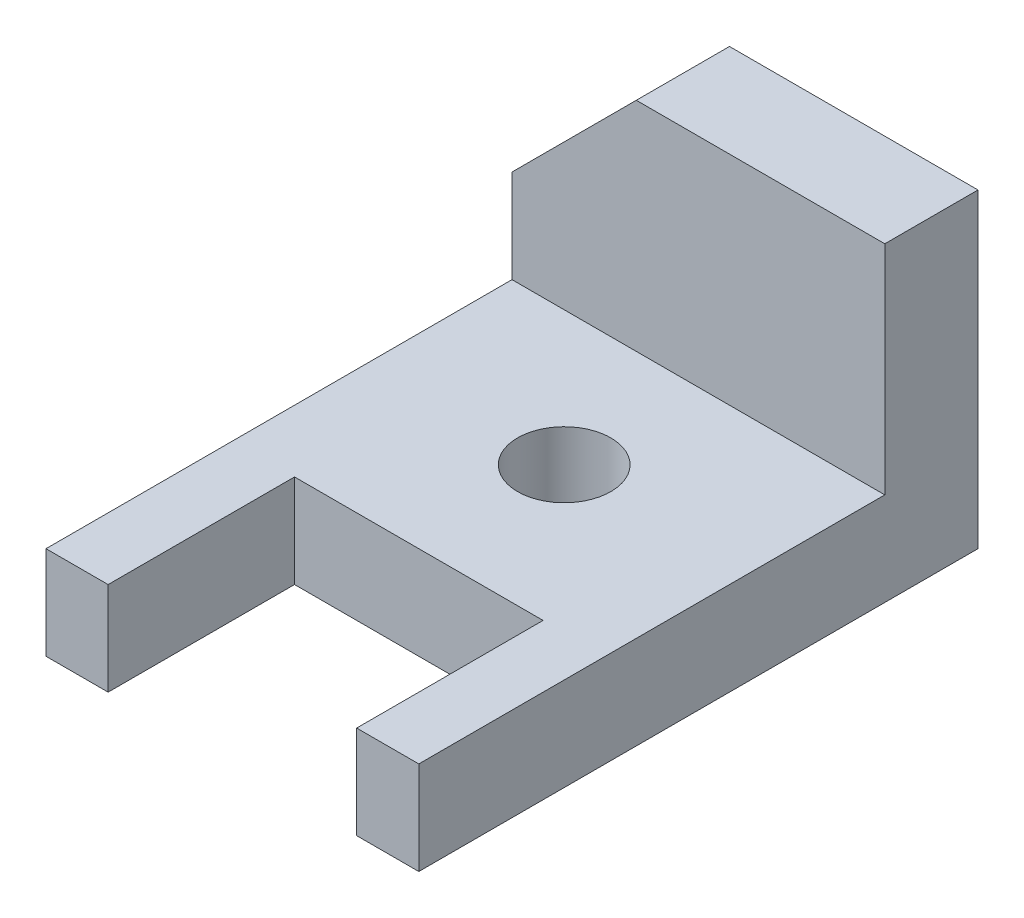
ISO-10303-21;
HEADER;
FILE_DESCRIPTION(('STEP AP214'),'2;1');
FILE_NAME('part.step','',(''),(''),'','','');
FILE_SCHEMA(('AUTOMOTIVE_DESIGN { 1 0 10303 214 1 1 1 1 }'));
ENDSEC;
DATA;
#1=APPLICATION_CONTEXT('core data for automotive mechanical design processes');
#2=APPLICATION_PROTOCOL_DEFINITION('international standard','automotive_design',2000,#1);
#3=PRODUCT_CONTEXT('',#1,'mechanical');
#4=PRODUCT('Part','Part','',(#3));
#5=PRODUCT_RELATED_PRODUCT_CATEGORY('part','',(#4));
#6=PRODUCT_DEFINITION_FORMATION('','',#4);
#7=PRODUCT_DEFINITION_CONTEXT('part definition',#1,'design');
#8=PRODUCT_DEFINITION('design','',#6,#7);
#9=PRODUCT_DEFINITION_SHAPE('','',#8);
#10=(LENGTH_UNIT() NAMED_UNIT(*) SI_UNIT(.MILLI.,.METRE.));
#11=(NAMED_UNIT(*) PLANE_ANGLE_UNIT() SI_UNIT($,.RADIAN.));
#12=(NAMED_UNIT(*) SI_UNIT($,.STERADIAN.) SOLID_ANGLE_UNIT());
#13=UNCERTAINTY_MEASURE_WITH_UNIT(LENGTH_MEASURE(1.E-05),#10,'distance_accuracy_value','');
#14=(GEOMETRIC_REPRESENTATION_CONTEXT(3) GLOBAL_UNCERTAINTY_ASSIGNED_CONTEXT((#13)) GLOBAL_UNIT_ASSIGNED_CONTEXT((#10,
#11,#12)) REPRESENTATION_CONTEXT('',''));
#15=CARTESIAN_POINT('',(0.,0.,0.));
#16=DIRECTION('',(0.,0.,1.));
#17=DIRECTION('',(1.,0.,0.));
#18=AXIS2_PLACEMENT_3D('',#15,#16,#17);
#19=CARTESIAN_POINT('',(-97.2844660194175,19.05,21.0844660194175));
#20=DIRECTION('',(0.,0.,-1.));
#21=DIRECTION('',(-1.,0.,0.));
#22=AXIS2_PLACEMENT_3D('',#19,#20,#21);
#23=PLANE('',#22);
#24=DIRECTION('',(1.,0.,0.));
#25=VECTOR('',#24,1.);
#26=CARTESIAN_POINT('',(-97.2844660194175,0.,21.0844660194175));
#27=LINE('',#26,#25);
#28=CARTESIAN_POINT('',(-173.484466019418,0.,21.0844660194175));
#29=VERTEX_POINT('',#28);
#30=CARTESIAN_POINT('',(-160.784466019418,0.,21.0844660194175));
#31=VERTEX_POINT('',#30);
#32=EDGE_CURVE('E150',#29,#31,#27,.T.);
#33=ORIENTED_EDGE('',*,*,#32,.T.);
#34=DIRECTION('',(0.,-1.,0.));
#35=VECTOR('',#34,1.);
#36=CARTESIAN_POINT('',(-160.784466019418,19.05,21.0844660194175));
#37=LINE('',#36,#35);
#38=CARTESIAN_POINT('',(-160.784466019418,19.05,21.0844660194175));
#39=VERTEX_POINT('',#38);
#40=EDGE_CURVE('E207',#39,#31,#37,.T.);
#41=ORIENTED_EDGE('',*,*,#40,.F.);
#42=DIRECTION('',(1.,0.,0.));
#43=VECTOR('',#42,1.);
#44=CARTESIAN_POINT('',(-97.2844660194175,19.05,21.0844660194175));
#45=LINE('',#44,#43);
#46=CARTESIAN_POINT('',(-173.484466019418,19.05,21.0844660194175));
#47=VERTEX_POINT('',#46);
#48=EDGE_CURVE('E153',#47,#39,#45,.T.);
#49=ORIENTED_EDGE('',*,*,#48,.F.);
#50=DIRECTION('',(0.,-1.,0.));
#51=VECTOR('',#50,1.);
#52=CARTESIAN_POINT('',(-173.484466019418,19.05,21.0844660194175));
#53=LINE('',#52,#51);
#54=EDGE_CURVE('E168',#47,#29,#53,.T.);
#55=ORIENTED_EDGE('',*,*,#54,.T.);
#56=EDGE_LOOP('',(#33,#41,#49,#55));
#57=FACE_BOUND('',#56,.T.);
#58=ADVANCED_FACE('F35',(#57),#23,.F.);
#59=CARTESIAN_POINT('',(-97.2844660194175,19.05,21.0844660194175));
#60=DIRECTION('',(-1.,0.,0.));
#61=DIRECTION('',(0.,0.,1.));
#62=AXIS2_PLACEMENT_3D('',#59,#60,#61);
#63=PLANE('',#62);
#64=DIRECTION('',(0.,0.,-1.));
#65=VECTOR('',#64,1.);
#66=CARTESIAN_POINT('',(-97.2844660194175,0.,21.0844660194175));
#67=LINE('',#66,#65);
#68=CARTESIAN_POINT('',(-97.2844660194175,0.,21.0844660194175));
#69=VERTEX_POINT('',#68);
#70=CARTESIAN_POINT('',(-97.2844660194175,0.,-93.2155339805825));
#71=VERTEX_POINT('',#70);
#72=EDGE_CURVE('E140',#69,#71,#67,.T.);
#73=ORIENTED_EDGE('',*,*,#72,.T.);
#74=DIRECTION('',(0.,-1.,0.));
#75=VECTOR('',#74,1.);
#76=CARTESIAN_POINT('',(-97.2844660194175,19.05,-93.2155339805825));
#77=LINE('',#76,#75);
#78=CARTESIAN_POINT('',(-97.2844660194175,63.5,-93.2155339805825));
#79=VERTEX_POINT('',#78);
#80=EDGE_CURVE('E43',#79,#71,#77,.T.);
#81=ORIENTED_EDGE('',*,*,#80,.F.);
#82=DIRECTION('',(0.,0.,1.));
#83=VECTOR('',#82,1.);
#84=CARTESIAN_POINT('',(-97.2844660194175,63.5,-93.2155339805825));
#85=LINE('',#84,#83);
#86=CARTESIAN_POINT('',(-97.2844660194175,63.5,-74.1655339805825));
#87=VERTEX_POINT('',#86);
#88=EDGE_CURVE('E182',#79,#87,#85,.T.);
#89=ORIENTED_EDGE('',*,*,#88,.T.);
#90=DIRECTION('',(0.,-1.,0.));
#91=VECTOR('',#90,1.);
#92=CARTESIAN_POINT('',(-97.2844660194175,63.5,-74.1655339805825));
#93=LINE('',#92,#91);
#94=CARTESIAN_POINT('',(-97.2844660194175,19.05,-74.1655339805825));
#95=VERTEX_POINT('',#94);
#96=EDGE_CURVE('E138',#87,#95,#93,.T.);
#97=ORIENTED_EDGE('',*,*,#96,.T.);
#98=DIRECTION('',(0.,0.,-1.));
#99=VECTOR('',#98,1.);
#100=CARTESIAN_POINT('',(-97.2844660194175,19.05,21.0844660194175));
#101=LINE('',#100,#99);
#102=CARTESIAN_POINT('',(-97.2844660194175,19.05,21.0844660194175));
#103=VERTEX_POINT('',#102);
#104=EDGE_CURVE('E148',#103,#95,#101,.T.);
#105=ORIENTED_EDGE('',*,*,#104,.F.);
#106=DIRECTION('',(0.,-1.,0.));
#107=VECTOR('',#106,1.);
#108=CARTESIAN_POINT('',(-97.2844660194175,19.05,21.0844660194175));
#109=LINE('',#108,#107);
#110=EDGE_CURVE('E156',#103,#69,#109,.T.);
#111=ORIENTED_EDGE('',*,*,#110,.T.);
#112=EDGE_LOOP('',(#73,#81,#89,#97,#105,#111));
#113=FACE_BOUND('',#112,.T.);
#114=ADVANCED_FACE('F37',(#113),#63,.F.);
#115=CARTESIAN_POINT('',(-97.2844660194175,19.05,-93.2155339805825));
#116=DIRECTION('',(0.,0.,1.));
#117=DIRECTION('',(1.,0.,0.));
#118=AXIS2_PLACEMENT_3D('',#115,#116,#117);
#119=PLANE('',#118);
#120=DIRECTION('',(0.,-1.,0.));
#121=VECTOR('',#120,1.);
#122=CARTESIAN_POINT('',(-173.484466019418,19.05,-93.2155339805825));
#123=LINE('',#122,#121);
#124=CARTESIAN_POINT('',(-173.484466019418,38.1,-93.2155339805825));
#125=VERTEX_POINT('',#124);
#126=CARTESIAN_POINT('',(-173.484466019418,0.,-93.2155339805825));
#127=VERTEX_POINT('',#126);
#128=EDGE_CURVE('E171',#125,#127,#123,.T.);
#129=ORIENTED_EDGE('',*,*,#128,.F.);
#130=DIRECTION('',(0.707106781186547,0.707106781186548,0.));
#131=VECTOR('',#130,1.);
#132=CARTESIAN_POINT('',(-144.909466019418,66.675,-93.2155339805825));
#133=LINE('',#132,#131);
#134=CARTESIAN_POINT('',(-148.084466019418,63.5,-93.2155339805825));
#135=VERTEX_POINT('',#134);
#136=EDGE_CURVE('E119',#125,#135,#133,.T.);
#137=ORIENTED_EDGE('',*,*,#136,.T.);
#138=DIRECTION('',(1.,0.,0.));
#139=VECTOR('',#138,1.);
#140=CARTESIAN_POINT('',(-97.2844660194175,63.5,-93.2155339805825));
#141=LINE('',#140,#139);
#142=EDGE_CURVE('E143',#135,#79,#141,.T.);
#143=ORIENTED_EDGE('',*,*,#142,.T.);
#144=ORIENTED_EDGE('',*,*,#80,.T.);
#145=DIRECTION('',(-1.,0.,0.));
#146=VECTOR('',#145,1.);
#147=CARTESIAN_POINT('',(-97.2844660194175,0.,-93.2155339805825));
#148=LINE('',#147,#146);
#149=EDGE_CURVE('E158',#71,#127,#148,.T.);
#150=ORIENTED_EDGE('',*,*,#149,.T.);
#151=EDGE_LOOP('',(#129,#137,#143,#144,#150));
#152=FACE_BOUND('',#151,.T.);
#153=ADVANCED_FACE('F175',(#152),#119,.F.);
#154=CARTESIAN_POINT('',(-173.484466019418,19.05,21.0844660194175));
#155=DIRECTION('',(1.,0.,0.));
#156=DIRECTION('',(0.,0.,-1.));
#157=AXIS2_PLACEMENT_3D('',#154,#155,#156);
#158=PLANE('',#157);
#159=DIRECTION('',(0.,-1.,0.));
#160=VECTOR('',#159,1.);
#161=CARTESIAN_POINT('',(-173.484466019418,63.5,-74.1655339805826));
#162=LINE('',#161,#160);
#163=CARTESIAN_POINT('',(-173.484466019418,38.1,-74.1655339805825));
#164=VERTEX_POINT('',#163);
#165=CARTESIAN_POINT('',(-173.484466019418,19.05,-74.1655339805825));
#166=VERTEX_POINT('',#165);
#167=EDGE_CURVE('E128',#164,#166,#162,.T.);
#168=ORIENTED_EDGE('',*,*,#167,.F.);
#169=DIRECTION('',(0.,0.,1.));
#170=VECTOR('',#169,1.);
#171=CARTESIAN_POINT('',(-173.484466019418,38.1,-112.265533980583));
#172=LINE('',#171,#170);
#173=EDGE_CURVE('E116',#125,#164,#172,.T.);
#174=ORIENTED_EDGE('',*,*,#173,.F.);
#175=ORIENTED_EDGE('',*,*,#128,.T.);
#176=DIRECTION('',(0.,0.,1.));
#177=VECTOR('',#176,1.);
#178=CARTESIAN_POINT('',(-173.484466019418,0.,21.0844660194175));
#179=LINE('',#178,#177);
#180=EDGE_CURVE('E161',#127,#29,#179,.T.);
#181=ORIENTED_EDGE('',*,*,#180,.T.);
#182=ORIENTED_EDGE('',*,*,#54,.F.);
#183=DIRECTION('',(0.,0.,1.));
#184=VECTOR('',#183,1.);
#185=CARTESIAN_POINT('',(-173.484466019418,19.05,21.0844660194175));
#186=LINE('',#185,#184);
#187=EDGE_CURVE('E136',#166,#47,#186,.T.);
#188=ORIENTED_EDGE('',*,*,#187,.F.);
#189=EDGE_LOOP('',(#168,#174,#175,#181,#182,#188));
#190=FACE_BOUND('',#189,.T.);
#191=ADVANCED_FACE('F134',(#190),#158,.F.);
#192=CARTESIAN_POINT('',(-109.984466019418,19.05,21.0844660194175));
#193=VERTEX_POINT('',#192);
#194=EDGE_CURVE('E152',#193,#103,#45,.T.);
#195=ORIENTED_EDGE('',*,*,#194,.F.);
#196=DIRECTION('',(0.,1.,0.));
#197=VECTOR('',#196,1.);
#198=CARTESIAN_POINT('',(-109.984466019418,19.05,21.0844660194175));
#199=LINE('',#198,#197);
#200=CARTESIAN_POINT('',(-109.984466019418,0.,21.0844660194175));
#201=VERTEX_POINT('',#200);
#202=EDGE_CURVE('E205',#201,#193,#199,.T.);
#203=ORIENTED_EDGE('',*,*,#202,.F.);
#204=EDGE_CURVE('E163',#201,#69,#27,.T.);
#205=ORIENTED_EDGE('',*,*,#204,.T.);
#206=ORIENTED_EDGE('',*,*,#110,.F.);
#207=EDGE_LOOP('',(#195,#203,#205,#206));
#208=FACE_BOUND('',#207,.T.);
#209=ADVANCED_FACE('F238',(#208),#23,.F.);
#210=CARTESIAN_POINT('',(0.,19.05,0.));
#211=DIRECTION('',(0.,1.,0.));
#212=DIRECTION('',(0.,0.,1.));
#213=AXIS2_PLACEMENT_3D('',#210,#211,#212);
#214=PLANE('',#213);
#215=DIRECTION('',(0.,0.,1.));
#216=VECTOR('',#215,1.);
#217=CARTESIAN_POINT('',(-160.784466019418,19.05,-17.0155339805825));
#218=LINE('',#217,#216);
#219=CARTESIAN_POINT('',(-160.784466019418,19.05,-17.0155339805825));
#220=VERTEX_POINT('',#219);
#221=EDGE_CURVE('E194',#220,#39,#218,.T.);
#222=ORIENTED_EDGE('',*,*,#221,.F.);
#223=DIRECTION('',(-1.,0.,0.));
#224=VECTOR('',#223,1.);
#225=CARTESIAN_POINT('',(-160.784466019418,19.05,-17.0155339805825));
#226=LINE('',#225,#224);
#227=CARTESIAN_POINT('',(-109.984466019418,19.05,-17.0155339805825));
#228=VERTEX_POINT('',#227);
#229=EDGE_CURVE('E199',#228,#220,#226,.T.);
#230=ORIENTED_EDGE('',*,*,#229,.F.);
#231=DIRECTION('',(0.,0.,1.));
#232=VECTOR('',#231,1.);
#233=CARTESIAN_POINT('',(-109.984466019418,19.05,-17.0155339805825));
#234=LINE('',#233,#232);
#235=EDGE_CURVE('E201',#228,#193,#234,.T.);
#236=ORIENTED_EDGE('',*,*,#235,.T.);
#237=ORIENTED_EDGE('',*,*,#194,.T.);
#238=ORIENTED_EDGE('',*,*,#104,.T.);
#239=DIRECTION('',(1.,0.,0.));
#240=VECTOR('',#239,1.);
#241=CARTESIAN_POINT('',(0.,19.05,-74.1655339805825));
#242=LINE('',#241,#240);
#243=EDGE_CURVE('E137',#166,#95,#242,.T.);
#244=ORIENTED_EDGE('',*,*,#243,.F.);
#245=ORIENTED_EDGE('',*,*,#187,.T.);
#246=ORIENTED_EDGE('',*,*,#48,.T.);
#247=EDGE_LOOP('',(#222,#230,#236,#237,#238,#244,#245,#246));
#248=FACE_BOUND('',#247,.T.);
#249=CARTESIAN_POINT('',(-135.384466019418,19.05,-46.7335339805825));
#250=DIRECTION('',(0.,1.,0.));
#251=DIRECTION('',(0.,0.,1.));
#252=AXIS2_PLACEMENT_3D('',#249,#250,#251);
#253=CIRCLE('',#252,9.52500000000001);
#254=CARTESIAN_POINT('',(-135.384466019418,19.05,-37.2085339805825));
#255=VERTEX_POINT('',#254);
#256=EDGE_CURVE('E189',#255,#255,#253,.T.);
#257=ORIENTED_EDGE('',*,*,#256,.F.);
#258=EDGE_LOOP('',(#257));
#259=FACE_BOUND('',#258,.T.);
#260=ADVANCED_FACE('F229',(#248,#259),#214,.T.);
#261=CARTESIAN_POINT('',(0.,0.,0.));
#262=DIRECTION('',(0.,1.,0.));
#263=DIRECTION('',(0.,0.,1.));
#264=AXIS2_PLACEMENT_3D('',#261,#262,#263);
#265=PLANE('',#264);
#266=DIRECTION('',(1.,0.,0.));
#267=VECTOR('',#266,1.);
#268=CARTESIAN_POINT('',(-160.784466019418,0.,-17.0155339805825));
#269=LINE('',#268,#267);
#270=CARTESIAN_POINT('',(-160.784466019418,0.,-17.0155339805825));
#271=VERTEX_POINT('',#270);
#272=CARTESIAN_POINT('',(-109.984466019418,0.,-17.0155339805825));
#273=VERTEX_POINT('',#272);
#274=EDGE_CURVE('E213',#271,#273,#269,.T.);
#275=ORIENTED_EDGE('',*,*,#274,.F.);
#276=DIRECTION('',(0.,0.,1.));
#277=VECTOR('',#276,1.);
#278=CARTESIAN_POINT('',(-160.784466019418,0.,-17.0155339805825));
#279=LINE('',#278,#277);
#280=EDGE_CURVE('E195',#271,#31,#279,.T.);
#281=ORIENTED_EDGE('',*,*,#280,.T.);
#282=ORIENTED_EDGE('',*,*,#32,.F.);
#283=ORIENTED_EDGE('',*,*,#180,.F.);
#284=ORIENTED_EDGE('',*,*,#149,.F.);
#285=ORIENTED_EDGE('',*,*,#72,.F.);
#286=ORIENTED_EDGE('',*,*,#204,.F.);
#287=DIRECTION('',(0.,0.,1.));
#288=VECTOR('',#287,1.);
#289=CARTESIAN_POINT('',(-109.984466019418,0.,-17.0155339805825));
#290=LINE('',#289,#288);
#291=EDGE_CURVE('E198',#273,#201,#290,.T.);
#292=ORIENTED_EDGE('',*,*,#291,.F.);
#293=EDGE_LOOP('',(#275,#281,#282,#283,#284,#285,#286,#292));
#294=FACE_BOUND('',#293,.T.);
#295=CARTESIAN_POINT('',(-135.384466019418,0.,-46.7335339805825));
#296=DIRECTION('',(0.,1.,0.));
#297=DIRECTION('',(0.,0.,1.));
#298=AXIS2_PLACEMENT_3D('',#295,#296,#297);
#299=CIRCLE('',#298,9.52500000000001);
#300=CARTESIAN_POINT('',(-135.384466019418,0.,-37.2085339805825));
#301=VERTEX_POINT('',#300);
#302=EDGE_CURVE('E186',#301,#301,#299,.T.);
#303=ORIENTED_EDGE('',*,*,#302,.T.);
#304=EDGE_LOOP('',(#303));
#305=FACE_BOUND('',#304,.T.);
#306=ADVANCED_FACE('F222',(#294,#305),#265,.F.);
#307=CARTESIAN_POINT('',(-97.2844660194175,63.5,-74.1655339805825));
#308=DIRECTION('',(0.,0.,1.));
#309=DIRECTION('',(1.,0.,0.));
#310=AXIS2_PLACEMENT_3D('',#307,#308,#309);
#311=PLANE('',#310);
#312=DIRECTION('',(0.707106781186547,0.707106781186548,0.));
#313=VECTOR('',#312,1.);
#314=CARTESIAN_POINT('',(-173.484466019418,38.1,-74.1655339805825));
#315=LINE('',#314,#313);
#316=CARTESIAN_POINT('',(-148.084466019418,63.5,-74.1655339805826));
#317=VERTEX_POINT('',#316);
#318=EDGE_CURVE('E50',#164,#317,#315,.T.);
#319=ORIENTED_EDGE('',*,*,#318,.F.);
#320=ORIENTED_EDGE('',*,*,#167,.T.);
#321=ORIENTED_EDGE('',*,*,#243,.T.);
#322=ORIENTED_EDGE('',*,*,#96,.F.);
#323=DIRECTION('',(-1.,0.,0.));
#324=VECTOR('',#323,1.);
#325=CARTESIAN_POINT('',(-97.2844660194175,63.5,-74.1655339805825));
#326=LINE('',#325,#324);
#327=EDGE_CURVE('E131',#87,#317,#326,.T.);
#328=ORIENTED_EDGE('',*,*,#327,.T.);
#329=EDGE_LOOP('',(#319,#320,#321,#322,#328));
#330=FACE_BOUND('',#329,.T.);
#331=ADVANCED_FACE('F126',(#330),#311,.T.);
#332=CARTESIAN_POINT('',(0.,63.5,0.));
#333=DIRECTION('',(0.,-1.,0.));
#334=DIRECTION('',(0.,0.,-1.));
#335=AXIS2_PLACEMENT_3D('',#332,#333,#334);
#336=PLANE('',#335);
#337=ORIENTED_EDGE('',*,*,#142,.F.);
#338=DIRECTION('',(0.,0.,1.));
#339=VECTOR('',#338,1.);
#340=CARTESIAN_POINT('',(-148.084466019418,63.5,0.));
#341=LINE('',#340,#339);
#342=EDGE_CURVE('E11',#135,#317,#341,.T.);
#343=ORIENTED_EDGE('',*,*,#342,.T.);
#344=ORIENTED_EDGE('',*,*,#327,.F.);
#345=ORIENTED_EDGE('',*,*,#88,.F.);
#346=EDGE_LOOP('',(#337,#343,#344,#345));
#347=FACE_BOUND('',#346,.T.);
#348=ADVANCED_FACE('F185',(#347),#336,.F.);
#349=CARTESIAN_POINT('',(-135.384466019418,19.05,-46.7335339805825));
#350=DIRECTION('',(0.,1.,0.));
#351=DIRECTION('',(0.,0.,1.));
#352=AXIS2_PLACEMENT_3D('',#349,#350,#351);
#353=CYLINDRICAL_SURFACE('',#352,9.52500000000001);
#354=ORIENTED_EDGE('',*,*,#302,.F.);
#355=EDGE_LOOP('',(#354));
#356=FACE_BOUND('',#355,.T.);
#357=ORIENTED_EDGE('',*,*,#256,.T.);
#358=EDGE_LOOP('',(#357));
#359=FACE_BOUND('',#358,.T.);
#360=ADVANCED_FACE('F279',(#356,#359),#353,.F.);
#361=CARTESIAN_POINT('',(-160.784466019418,19.05,-17.0155339805825));
#362=DIRECTION('',(-1.,0.,0.));
#363=DIRECTION('',(0.,0.,1.));
#364=AXIS2_PLACEMENT_3D('',#361,#362,#363);
#365=PLANE('',#364);
#366=ORIENTED_EDGE('',*,*,#40,.T.);
#367=ORIENTED_EDGE('',*,*,#280,.F.);
#368=DIRECTION('',(0.,-1.,0.));
#369=VECTOR('',#368,1.);
#370=CARTESIAN_POINT('',(-160.784466019418,19.05,-17.0155339805825));
#371=LINE('',#370,#369);
#372=EDGE_CURVE('E57',#220,#271,#371,.T.);
#373=ORIENTED_EDGE('',*,*,#372,.F.);
#374=ORIENTED_EDGE('',*,*,#221,.T.);
#375=EDGE_LOOP('',(#366,#367,#373,#374));
#376=FACE_BOUND('',#375,.T.);
#377=ADVANCED_FACE('F226',(#376),#365,.F.);
#378=CARTESIAN_POINT('',(-109.984466019418,19.05,-17.0155339805825));
#379=DIRECTION('',(1.,0.,0.));
#380=DIRECTION('',(0.,0.,-1.));
#381=AXIS2_PLACEMENT_3D('',#378,#379,#380);
#382=PLANE('',#381);
#383=ORIENTED_EDGE('',*,*,#202,.T.);
#384=ORIENTED_EDGE('',*,*,#235,.F.);
#385=DIRECTION('',(0.,1.,0.));
#386=VECTOR('',#385,1.);
#387=CARTESIAN_POINT('',(-109.984466019418,19.05,-17.0155339805825));
#388=LINE('',#387,#386);
#389=EDGE_CURVE('E210',#273,#228,#388,.T.);
#390=ORIENTED_EDGE('',*,*,#389,.F.);
#391=ORIENTED_EDGE('',*,*,#291,.T.);
#392=EDGE_LOOP('',(#383,#384,#390,#391));
#393=FACE_BOUND('',#392,.T.);
#394=ADVANCED_FACE('F240',(#393),#382,.F.);
#395=CARTESIAN_POINT('',(0.,0.,-17.0155339805825));
#396=DIRECTION('',(0.,0.,1.));
#397=DIRECTION('',(1.,0.,0.));
#398=AXIS2_PLACEMENT_3D('',#395,#396,#397);
#399=PLANE('',#398);
#400=ORIENTED_EDGE('',*,*,#372,.T.);
#401=ORIENTED_EDGE('',*,*,#274,.T.);
#402=ORIENTED_EDGE('',*,*,#389,.T.);
#403=ORIENTED_EDGE('',*,*,#229,.T.);
#404=EDGE_LOOP('',(#400,#401,#402,#403));
#405=FACE_BOUND('',#404,.T.);
#406=ADVANCED_FACE('F241',(#405),#399,.T.);
#407=CARTESIAN_POINT('',(-173.484466019418,38.1,-112.265533980583));
#408=DIRECTION('',(0.707106781186548,-0.707106781186547,0.));
#409=DIRECTION('',(0.707106781186547,0.707106781186548,0.));
#410=AXIS2_PLACEMENT_3D('',#407,#408,#409);
#411=PLANE('',#410);
#412=ORIENTED_EDGE('',*,*,#173,.T.);
#413=ORIENTED_EDGE('',*,*,#318,.T.);
#414=ORIENTED_EDGE('',*,*,#342,.F.);
#415=ORIENTED_EDGE('',*,*,#136,.F.);
#416=EDGE_LOOP('',(#412,#413,#414,#415));
#417=FACE_BOUND('',#416,.T.);
#418=ADVANCED_FACE('F117',(#417),#411,.F.);
#419=CLOSED_SHELL('',(#58,#114,#153,#191,#209,#260,#306,#331,#348,#360,#377,#394,#406,#418));
#420=MANIFOLD_SOLID_BREP('B2',#419);
#421=ADVANCED_BREP_SHAPE_REPRESENTATION('',(#18,#420),#14);
#422=SHAPE_DEFINITION_REPRESENTATION(#9,#421);
ENDSEC;
END-ISO-10303-21;
